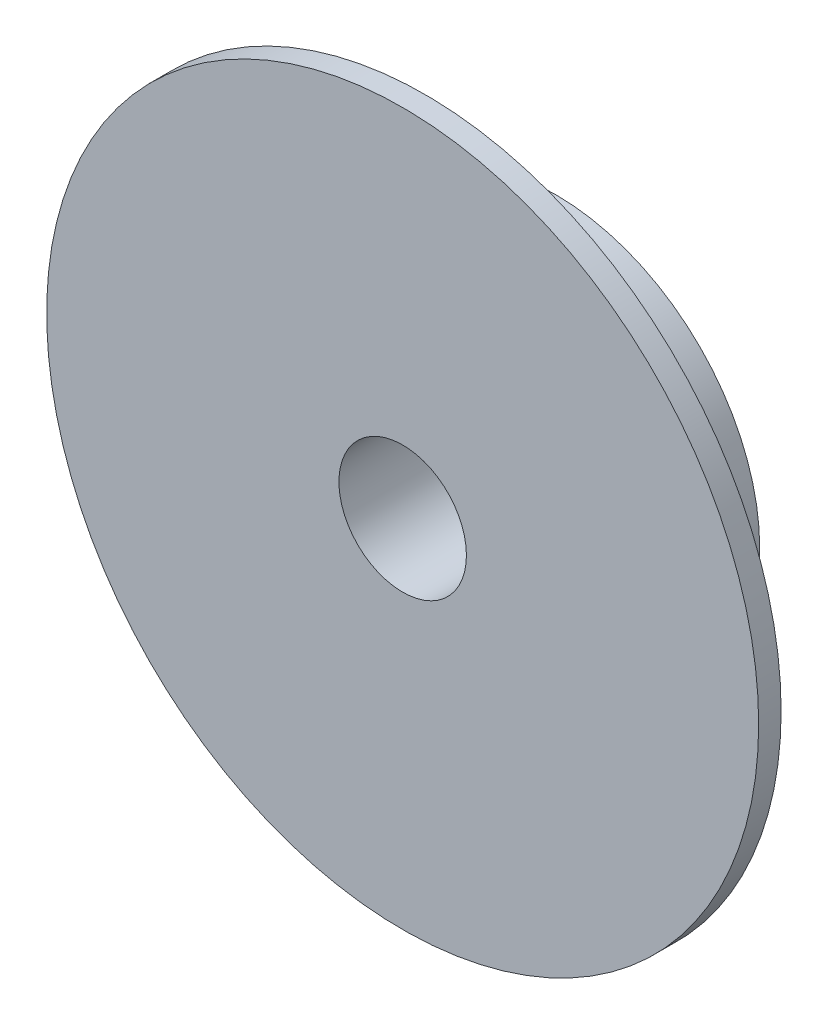
ISO-10303-21;
HEADER;
FILE_DESCRIPTION(('STEP AP214'),'2;1');
FILE_NAME('part.step','',(''),(''),'','','');
FILE_SCHEMA(('AUTOMOTIVE_DESIGN { 1 0 10303 214 1 1 1 1 }'));
ENDSEC;
DATA;
#1=APPLICATION_CONTEXT('core data for automotive mechanical design processes');
#2=APPLICATION_PROTOCOL_DEFINITION('international standard','automotive_design',2000,#1);
#3=PRODUCT_CONTEXT('',#1,'mechanical');
#4=PRODUCT('Part','Part','',(#3));
#5=PRODUCT_RELATED_PRODUCT_CATEGORY('part','',(#4));
#6=PRODUCT_DEFINITION_FORMATION('','',#4);
#7=PRODUCT_DEFINITION_CONTEXT('part definition',#1,'design');
#8=PRODUCT_DEFINITION('design','',#6,#7);
#9=PRODUCT_DEFINITION_SHAPE('','',#8);
#10=(LENGTH_UNIT() NAMED_UNIT(*) SI_UNIT(.MILLI.,.METRE.));
#11=(NAMED_UNIT(*) PLANE_ANGLE_UNIT() SI_UNIT($,.RADIAN.));
#12=(NAMED_UNIT(*) SI_UNIT($,.STERADIAN.) SOLID_ANGLE_UNIT());
#13=UNCERTAINTY_MEASURE_WITH_UNIT(LENGTH_MEASURE(1.E-05),#10,'distance_accuracy_value','');
#14=(GEOMETRIC_REPRESENTATION_CONTEXT(3) GLOBAL_UNCERTAINTY_ASSIGNED_CONTEXT((#13)) GLOBAL_UNIT_ASSIGNED_CONTEXT((#10,
#11,#12)) REPRESENTATION_CONTEXT('',''));
#15=CARTESIAN_POINT('',(0.,0.,0.));
#16=DIRECTION('',(0.,0.,1.));
#17=DIRECTION('',(1.,0.,0.));
#18=AXIS2_PLACEMENT_3D('',#15,#16,#17);
#19=CARTESIAN_POINT('',(0.,0.,0.));
#20=DIRECTION('',(0.,0.,1.));
#21=DIRECTION('',(1.,0.,0.));
#22=AXIS2_PLACEMENT_3D('',#19,#20,#21);
#23=PLANE('',#22);
#24=CARTESIAN_POINT('',(0.,0.,0.));
#25=DIRECTION('',(0.,0.,1.));
#26=DIRECTION('',(1.,0.,0.));
#27=AXIS2_PLACEMENT_3D('',#24,#25,#26);
#28=CIRCLE('',#27,44.323);
#29=CARTESIAN_POINT('',(44.323,0.,0.));
#30=VERTEX_POINT('',#29);
#31=EDGE_CURVE('E41',#30,#30,#28,.T.);
#32=ORIENTED_EDGE('',*,*,#31,.F.);
#33=EDGE_LOOP('',(#32));
#34=FACE_BOUND('',#33,.T.);
#35=CARTESIAN_POINT('',(0.,0.,0.));
#36=DIRECTION('',(0.,0.,1.));
#37=DIRECTION('',(1.,0.,0.));
#38=AXIS2_PLACEMENT_3D('',#35,#36,#37);
#39=CIRCLE('',#38,25.4);
#40=CARTESIAN_POINT('',(25.4,0.,0.));
#41=VERTEX_POINT('',#40);
#42=EDGE_CURVE('E10',#41,#41,#39,.F.);
#43=ORIENTED_EDGE('',*,*,#42,.F.);
#44=EDGE_LOOP('',(#43));
#45=FACE_BOUND('',#44,.T.);
#46=ADVANCED_FACE('F30',(#34,#45),#23,.F.);
#47=CARTESIAN_POINT('',(0.,0.,2.794));
#48=DIRECTION('',(0.,0.,-1.));
#49=DIRECTION('',(-1.,0.,0.));
#50=AXIS2_PLACEMENT_3D('',#47,#48,#49);
#51=CYLINDRICAL_SURFACE('',#50,44.323);
#52=CARTESIAN_POINT('',(0.,0.,2.794));
#53=DIRECTION('',(0.,0.,1.));
#54=DIRECTION('',(1.,0.,0.));
#55=AXIS2_PLACEMENT_3D('',#52,#53,#54);
#56=CIRCLE('',#55,44.323);
#57=CARTESIAN_POINT('',(44.323,0.,2.794));
#58=VERTEX_POINT('',#57);
#59=EDGE_CURVE('E37',#58,#58,#56,.T.);
#60=ORIENTED_EDGE('',*,*,#59,.F.);
#61=EDGE_LOOP('',(#60));
#62=FACE_BOUND('',#61,.T.);
#63=ORIENTED_EDGE('',*,*,#31,.T.);
#64=EDGE_LOOP('',(#63));
#65=FACE_BOUND('',#64,.T.);
#66=ADVANCED_FACE('F32',(#62,#65),#51,.T.);
#67=CARTESIAN_POINT('',(0.,0.,2.794));
#68=DIRECTION('',(0.,0.,1.));
#69=DIRECTION('',(1.,0.,0.));
#70=AXIS2_PLACEMENT_3D('',#67,#68,#69);
#71=PLANE('',#70);
#72=CARTESIAN_POINT('',(0.,0.,2.794));
#73=DIRECTION('',(0.,0.,1.));
#74=DIRECTION('',(1.,0.,0.));
#75=AXIS2_PLACEMENT_3D('',#72,#73,#74);
#76=CIRCLE('',#75,7.9375);
#77=CARTESIAN_POINT('',(7.9375,0.,2.794));
#78=VERTEX_POINT('',#77);
#79=EDGE_CURVE('E51',#78,#78,#76,.T.);
#80=ORIENTED_EDGE('',*,*,#79,.F.);
#81=EDGE_LOOP('',(#80));
#82=FACE_BOUND('',#81,.T.);
#83=ORIENTED_EDGE('',*,*,#59,.T.);
#84=EDGE_LOOP('',(#83));
#85=FACE_BOUND('',#84,.T.);
#86=ADVANCED_FACE('F66',(#82,#85),#71,.T.);
#87=CARTESIAN_POINT('',(0.,0.,-16.256));
#88=DIRECTION('',(0.,0.,1.));
#89=DIRECTION('',(1.,0.,0.));
#90=AXIS2_PLACEMENT_3D('',#87,#88,#89);
#91=CYLINDRICAL_SURFACE('',#90,25.4);
#92=CARTESIAN_POINT('',(0.,0.,-16.256));
#93=DIRECTION('',(0.,0.,-1.));
#94=DIRECTION('',(-1.,0.,0.));
#95=AXIS2_PLACEMENT_3D('',#92,#93,#94);
#96=CIRCLE('',#95,25.4);
#97=CARTESIAN_POINT('',(-25.4,0.,-16.256));
#98=VERTEX_POINT('',#97);
#99=EDGE_CURVE('E46',#98,#98,#96,.T.);
#100=ORIENTED_EDGE('',*,*,#99,.F.);
#101=EDGE_LOOP('',(#100));
#102=FACE_BOUND('',#101,.T.);
#103=ORIENTED_EDGE('',*,*,#42,.T.);
#104=EDGE_LOOP('',(#103));
#105=FACE_BOUND('',#104,.T.);
#106=ADVANCED_FACE('F68',(#102,#105),#91,.T.);
#107=CARTESIAN_POINT('',(0.,0.,-16.256));
#108=DIRECTION('',(0.,0.,-1.));
#109=DIRECTION('',(-1.,0.,0.));
#110=AXIS2_PLACEMENT_3D('',#107,#108,#109);
#111=PLANE('',#110);
#112=CARTESIAN_POINT('',(0.,0.,-16.256));
#113=DIRECTION('',(0.,0.,1.));
#114=DIRECTION('',(1.,0.,0.));
#115=AXIS2_PLACEMENT_3D('',#112,#113,#114);
#116=CIRCLE('',#115,7.9375);
#117=CARTESIAN_POINT('',(7.9375,0.,-16.256));
#118=VERTEX_POINT('',#117);
#119=EDGE_CURVE('E50',#118,#118,#116,.T.);
#120=ORIENTED_EDGE('',*,*,#119,.T.);
#121=EDGE_LOOP('',(#120));
#122=FACE_BOUND('',#121,.T.);
#123=ORIENTED_EDGE('',*,*,#99,.T.);
#124=EDGE_LOOP('',(#123));
#125=FACE_BOUND('',#124,.T.);
#126=ADVANCED_FACE('F57',(#122,#125),#111,.T.);
#127=CARTESIAN_POINT('',(0.,0.,-16.256));
#128=DIRECTION('',(0.,0.,1.));
#129=DIRECTION('',(1.,0.,0.));
#130=AXIS2_PLACEMENT_3D('',#127,#128,#129);
#131=CYLINDRICAL_SURFACE('',#130,7.9375);
#132=CARTESIAN_POINT('',(7.9375,0.,-16.256));
#133=CARTESIAN_POINT('',(7.9375,0.,-16.0575625));
#134=CARTESIAN_POINT('',(7.9375,0.,-15.859125));
#135=CARTESIAN_POINT('',(7.9375,0.,-15.46225));
#136=CARTESIAN_POINT('',(7.9375,0.,-15.2638125));
#137=CARTESIAN_POINT('',(7.9375,0.,-14.8669375));
#138=CARTESIAN_POINT('',(7.9375,0.,-14.6685));
#139=CARTESIAN_POINT('',(7.9375,0.,-14.271625));
#140=CARTESIAN_POINT('',(7.9375,0.,-14.0731875));
#141=CARTESIAN_POINT('',(7.9375,0.,-13.6763125));
#142=CARTESIAN_POINT('',(7.9375,0.,-13.477875));
#143=CARTESIAN_POINT('',(7.9375,0.,-13.081));
#144=CARTESIAN_POINT('',(7.9375,0.,-12.8825625));
#145=CARTESIAN_POINT('',(7.9375,0.,-12.4856875));
#146=CARTESIAN_POINT('',(7.9375,0.,-12.28725));
#147=CARTESIAN_POINT('',(7.9375,0.,-11.890375));
#148=CARTESIAN_POINT('',(7.9375,0.,-11.6919375));
#149=CARTESIAN_POINT('',(7.9375,0.,-11.2950625));
#150=CARTESIAN_POINT('',(7.9375,0.,-11.096625));
#151=CARTESIAN_POINT('',(7.9375,0.,-10.69975));
#152=CARTESIAN_POINT('',(7.9375,0.,-10.5013125));
#153=CARTESIAN_POINT('',(7.9375,0.,-10.1044375));
#154=CARTESIAN_POINT('',(7.9375,0.,-9.906));
#155=CARTESIAN_POINT('',(7.9375,0.,-9.509125));
#156=CARTESIAN_POINT('',(7.9375,0.,-9.3106875));
#157=CARTESIAN_POINT('',(7.9375,0.,-8.9138125));
#158=CARTESIAN_POINT('',(7.9375,0.,-8.715375));
#159=CARTESIAN_POINT('',(7.9375,0.,-8.3185));
#160=CARTESIAN_POINT('',(7.9375,0.,-8.1200625));
#161=CARTESIAN_POINT('',(7.9375,0.,-7.7231875));
#162=CARTESIAN_POINT('',(7.9375,0.,-7.52475));
#163=CARTESIAN_POINT('',(7.9375,0.,-7.127875));
#164=CARTESIAN_POINT('',(7.9375,0.,-6.9294375));
#165=CARTESIAN_POINT('',(7.9375,0.,-6.5325625));
#166=CARTESIAN_POINT('',(7.9375,0.,-6.334125));
#167=CARTESIAN_POINT('',(7.9375,0.,-5.93725));
#168=CARTESIAN_POINT('',(7.9375,0.,-5.7388125));
#169=CARTESIAN_POINT('',(7.9375,0.,-5.3419375));
#170=CARTESIAN_POINT('',(7.9375,0.,-5.1435));
#171=CARTESIAN_POINT('',(7.9375,0.,-4.746625));
#172=CARTESIAN_POINT('',(7.9375,0.,-4.5481875));
#173=CARTESIAN_POINT('',(7.9375,0.,-4.1513125));
#174=CARTESIAN_POINT('',(7.9375,0.,-3.952875));
#175=CARTESIAN_POINT('',(7.9375,0.,-3.556));
#176=CARTESIAN_POINT('',(7.9375,0.,-3.3575625));
#177=CARTESIAN_POINT('',(7.9375,0.,-2.9606875));
#178=CARTESIAN_POINT('',(7.9375,0.,-2.76225));
#179=CARTESIAN_POINT('',(7.9375,0.,-2.365375));
#180=CARTESIAN_POINT('',(7.9375,0.,-2.1669375));
#181=CARTESIAN_POINT('',(7.9375,0.,-1.7700625));
#182=CARTESIAN_POINT('',(7.9375,0.,-1.571625));
#183=CARTESIAN_POINT('',(7.9375,0.,-1.17475));
#184=CARTESIAN_POINT('',(7.9375,0.,-0.976312499999997));
#185=CARTESIAN_POINT('',(7.9375,0.,-0.579437499999998));
#186=CARTESIAN_POINT('',(7.9375,0.,-0.380999999999999));
#187=CARTESIAN_POINT('',(7.9375,0.,0.0158749999999997));
#188=CARTESIAN_POINT('',(7.9375,0.,0.2143125));
#189=CARTESIAN_POINT('',(7.9375,0.,0.6111875));
#190=CARTESIAN_POINT('',(7.9375,0.,0.809625));
#191=CARTESIAN_POINT('',(7.9375,0.,1.2065));
#192=CARTESIAN_POINT('',(7.9375,0.,1.4049375));
#193=CARTESIAN_POINT('',(7.9375,0.,1.8018125));
#194=CARTESIAN_POINT('',(7.9375,0.,2.00025));
#195=CARTESIAN_POINT('',(7.9375,0.,2.397125));
#196=CARTESIAN_POINT('',(7.9375,0.,2.5955625));
#197=CARTESIAN_POINT('',(7.9375,0.,2.794));
#198=B_SPLINE_CURVE_WITH_KNOTS('',3,(#132,#133,#134,#135,#136,#137,#138,#139,#140,#141,#142,
#143,#144,#145,#146,#147,#148,#149,#150,#151,#152,#153,#154,#155,#156,#157,#158,#159,#160,#161,
#162,#163,#164,#165,#166,#167,#168,#169,#170,#171,#172,#173,#174,#175,#176,#177,#178,#179,#180,
#181,#182,#183,#184,#185,#186,#187,#188,#189,#190,#191,#192,#193,#194,#195,#196,#197),
.UNSPECIFIED.,.F.,.F.,(4,2,2,2,2,2,2,2,2,2,2,2,2,2,2,2,2,2,2,2,2,2,2,2,2,2,2,2,2,2,2,2,4),(0.,
0.5953125,1.190625,1.7859375,2.38125,2.9765625,3.571875,4.1671875,4.7625,5.3578125,5.953125,
6.5484375,7.14375,7.7390625,8.334375,8.9296875,9.525,10.1203125,10.715625,11.3109375,11.90625,
12.5015625,13.096875,13.6921875,14.2875,14.8828125,15.478125,16.0734375,16.66875,17.2640625,
17.859375,18.4546875,19.05),.UNSPECIFIED.);
#199=EDGE_CURVE('BSEAM60',#118,#78,#198,.T.);
#200=ORIENTED_EDGE('',*,*,#119,.F.);
#201=ORIENTED_EDGE('',*,*,#79,.T.);
#202=ORIENTED_EDGE('',*,*,#199,.T.);
#203=ORIENTED_EDGE('',*,*,#199,.F.);
#204=EDGE_LOOP('',(#200,#202,#201,#203));
#205=FACE_BOUND('',#204,.T.);
#206=ADVANCED_FACE('F60',(#205),#131,.F.);
#207=CLOSED_SHELL('',(#46,#66,#86,#106,#126,#206));
#208=MANIFOLD_SOLID_BREP('B2',#207);
#209=ADVANCED_BREP_SHAPE_REPRESENTATION('',(#18,#208),#14);
#210=SHAPE_DEFINITION_REPRESENTATION(#9,#209);
ENDSEC;
END-ISO-10303-21;
